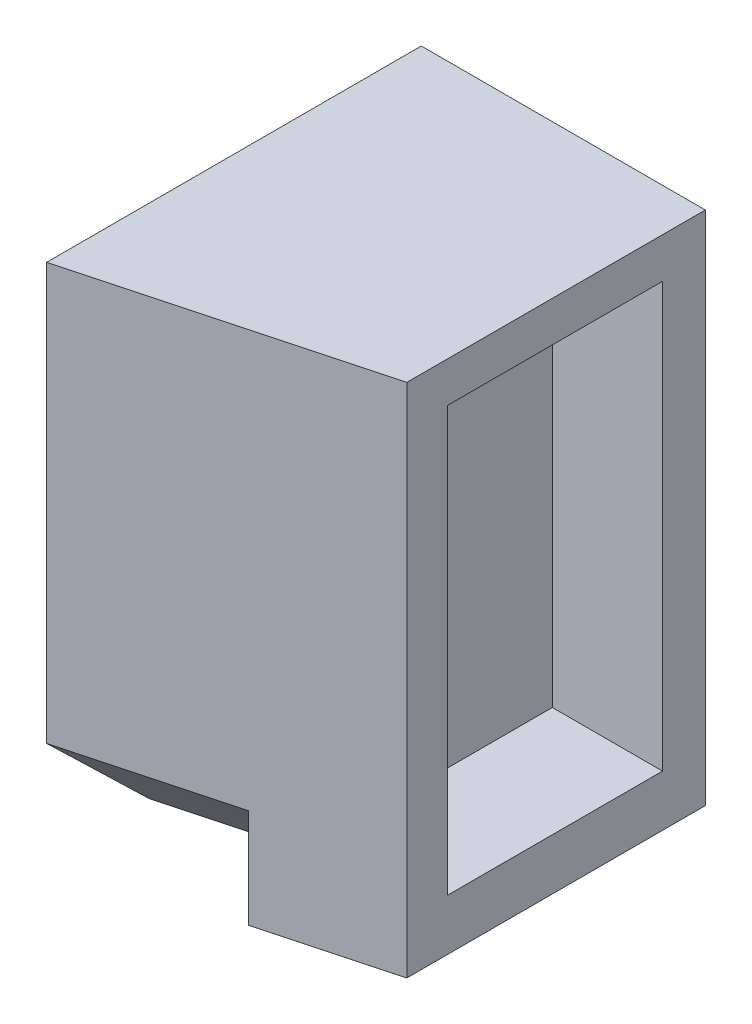
ISO-10303-21;
HEADER;
FILE_DESCRIPTION(('STEP AP214'),'2;1');
FILE_NAME('part.step','',(''),(''),'','','');
FILE_SCHEMA(('AUTOMOTIVE_DESIGN { 1 0 10303 214 1 1 1 1 }'));
ENDSEC;
DATA;
#1=APPLICATION_CONTEXT('core data for automotive mechanical design processes');
#2=APPLICATION_PROTOCOL_DEFINITION('international standard','automotive_design',2000,#1);
#3=PRODUCT_CONTEXT('',#1,'mechanical');
#4=PRODUCT('Part','Part','',(#3));
#5=PRODUCT_RELATED_PRODUCT_CATEGORY('part','',(#4));
#6=PRODUCT_DEFINITION_FORMATION('','',#4);
#7=PRODUCT_DEFINITION_CONTEXT('part definition',#1,'design');
#8=PRODUCT_DEFINITION('design','',#6,#7);
#9=PRODUCT_DEFINITION_SHAPE('','',#8);
#10=(LENGTH_UNIT() NAMED_UNIT(*) SI_UNIT(.MILLI.,.METRE.));
#11=(NAMED_UNIT(*) PLANE_ANGLE_UNIT() SI_UNIT($,.RADIAN.));
#12=(NAMED_UNIT(*) SI_UNIT($,.STERADIAN.) SOLID_ANGLE_UNIT());
#13=UNCERTAINTY_MEASURE_WITH_UNIT(LENGTH_MEASURE(1.E-05),#10,'distance_accuracy_value','');
#14=(GEOMETRIC_REPRESENTATION_CONTEXT(3) GLOBAL_UNCERTAINTY_ASSIGNED_CONTEXT((#13)) GLOBAL_UNIT_ASSIGNED_CONTEXT((#10,
#11,#12)) REPRESENTATION_CONTEXT('',''));
#15=CARTESIAN_POINT('',(0.,0.,0.));
#16=DIRECTION('',(0.,0.,1.));
#17=DIRECTION('',(1.,0.,0.));
#18=AXIS2_PLACEMENT_3D('',#15,#16,#17);
#19=CARTESIAN_POINT('',(0.,594.610277738046,0.));
#20=DIRECTION('',(1.,0.,0.));
#21=DIRECTION('',(0.,0.,-1.));
#22=AXIS2_PLACEMENT_3D('',#19,#20,#21);
#23=PLANE('',#22);
#24=DIRECTION('',(0.,0.,-1.));
#25=VECTOR('',#24,1.);
#26=CARTESIAN_POINT('',(0.,109.55,340.9));
#27=LINE('',#26,#25);
#28=CARTESIAN_POINT('',(0.,109.55,340.9));
#29=VERTEX_POINT('',#28);
#30=CARTESIAN_POINT('',(0.,109.55,90.9000000000001));
#31=VERTEX_POINT('',#30);
#32=EDGE_CURVE('E234',#29,#31,#27,.T.);
#33=ORIENTED_EDGE('',*,*,#32,.T.);
#34=DIRECTION('',(0.,1.,0.));
#35=VECTOR('',#34,1.);
#36=CARTESIAN_POINT('',(0.,309.55,90.9000000000001));
#37=LINE('',#36,#35);
#38=CARTESIAN_POINT('',(0.,309.55,90.9000000000001));
#39=VERTEX_POINT('',#38);
#40=EDGE_CURVE('E254',#31,#39,#37,.T.);
#41=ORIENTED_EDGE('',*,*,#40,.T.);
#42=DIRECTION('',(0.,0.,1.));
#43=VECTOR('',#42,1.);
#44=CARTESIAN_POINT('',(0.,309.55,340.9));
#45=LINE('',#44,#43);
#46=CARTESIAN_POINT('',(0.,309.55,340.9));
#47=VERTEX_POINT('',#46);
#48=EDGE_CURVE('E257',#39,#47,#45,.T.);
#49=ORIENTED_EDGE('',*,*,#48,.T.);
#50=DIRECTION('',(0.,-1.,0.));
#51=VECTOR('',#50,1.);
#52=CARTESIAN_POINT('',(0.,309.55,340.9));
#53=LINE('',#52,#51);
#54=EDGE_CURVE('E245',#47,#29,#53,.T.);
#55=ORIENTED_EDGE('',*,*,#54,.T.);
#56=EDGE_LOOP('',(#33,#41,#49,#55));
#57=FACE_BOUND('',#56,.T.);
#58=DIRECTION('',(0.,0.,1.));
#59=VECTOR('',#58,1.);
#60=CARTESIAN_POINT('',(0.,438.315,265.9));
#61=LINE('',#60,#59);
#62=CARTESIAN_POINT('',(0.,438.315,165.9));
#63=VERTEX_POINT('',#62);
#64=CARTESIAN_POINT('',(0.,438.315,265.9));
#65=VERTEX_POINT('',#64);
#66=EDGE_CURVE('E224',#63,#65,#61,.T.);
#67=ORIENTED_EDGE('',*,*,#66,.F.);
#68=DIRECTION('',(0.,-1.,0.));
#69=VECTOR('',#68,1.);
#70=CARTESIAN_POINT('',(0.,438.315,165.9));
#71=LINE('',#70,#69);
#72=CARTESIAN_POINT('',(0.,538.315,165.9));
#73=VERTEX_POINT('',#72);
#74=EDGE_CURVE('E207',#73,#63,#71,.T.);
#75=ORIENTED_EDGE('',*,*,#74,.F.);
#76=DIRECTION('',(0.,0.,-1.));
#77=VECTOR('',#76,1.);
#78=CARTESIAN_POINT('',(0.,538.315,265.9));
#79=LINE('',#78,#77);
#80=CARTESIAN_POINT('',(0.,538.315,265.9));
#81=VERTEX_POINT('',#80);
#82=EDGE_CURVE('E213',#81,#73,#79,.T.);
#83=ORIENTED_EDGE('',*,*,#82,.F.);
#84=DIRECTION('',(0.,1.,0.));
#85=VECTOR('',#84,1.);
#86=CARTESIAN_POINT('',(0.,438.315,265.9));
#87=LINE('',#86,#85);
#88=EDGE_CURVE('E227',#65,#81,#87,.T.);
#89=ORIENTED_EDGE('',*,*,#88,.F.);
#90=EDGE_LOOP('',(#67,#75,#83,#89));
#91=FACE_BOUND('',#90,.T.);
#92=DIRECTION('',(0.,-0.694746590606866,-0.719254596676403));
#93=VECTOR('',#92,1.);
#94=CARTESIAN_POINT('',(0.,130.362397394991,448.429017423315));
#95=LINE('',#94,#93);
#96=CARTESIAN_POINT('',(0.,114.3,431.8));
#97=VERTEX_POINT('',#96);
#98=CARTESIAN_POINT('',(0.,0.,313.467932579128));
#99=VERTEX_POINT('',#98);
#100=EDGE_CURVE('E192',#97,#99,#95,.T.);
#101=ORIENTED_EDGE('',*,*,#100,.F.);
#102=DIRECTION('',(0.,-1.,0.));
#103=VECTOR('',#102,1.);
#104=CARTESIAN_POINT('',(0.,594.610277738046,431.8));
#105=LINE('',#104,#103);
#106=CARTESIAN_POINT('',(0.,594.610277738046,431.8));
#107=VERTEX_POINT('',#106);
#108=EDGE_CURVE('E11',#107,#97,#105,.T.);
#109=ORIENTED_EDGE('',*,*,#108,.F.);
#110=DIRECTION('',(0.,0.,1.));
#111=VECTOR('',#110,1.);
#112=CARTESIAN_POINT('',(0.,594.610277738046,0.));
#113=LINE('',#112,#111);
#114=CARTESIAN_POINT('',(0.,594.610277738046,0.));
#115=VERTEX_POINT('',#114);
#116=EDGE_CURVE('E304',#115,#107,#113,.T.);
#117=ORIENTED_EDGE('',*,*,#116,.F.);
#118=DIRECTION('',(0.,-1.,0.));
#119=VECTOR('',#118,1.);
#120=CARTESIAN_POINT('',(0.,594.610277738046,0.));
#121=LINE('',#120,#119);
#122=CARTESIAN_POINT('',(0.,114.3,0.));
#123=VERTEX_POINT('',#122);
#124=EDGE_CURVE('E314',#115,#123,#121,.T.);
#125=ORIENTED_EDGE('',*,*,#124,.T.);
#126=DIRECTION('',(0.,0.707106781186548,-0.707106781186548));
#127=VECTOR('',#126,1.);
#128=CARTESIAN_POINT('',(0.,114.3,0.));
#129=LINE('',#128,#127);
#130=CARTESIAN_POINT('',(0.,0.,114.3));
#131=VERTEX_POINT('',#130);
#132=EDGE_CURVE('E196',#131,#123,#129,.T.);
#133=ORIENTED_EDGE('',*,*,#132,.F.);
#134=DIRECTION('',(0.,0.,1.));
#135=VECTOR('',#134,1.);
#136=CARTESIAN_POINT('',(0.,0.,0.));
#137=LINE('',#136,#135);
#138=EDGE_CURVE('E297',#131,#99,#137,.T.);
#139=ORIENTED_EDGE('',*,*,#138,.T.);
#140=EDGE_LOOP('',(#101,#109,#117,#125,#133,#139));
#141=FACE_BOUND('',#140,.T.);
#142=ADVANCED_FACE('F39',(#57,#91,#141),#23,.F.);
#143=CARTESIAN_POINT('',(0.,594.610277738046,431.8));
#144=DIRECTION('',(-0.258819045102518,0.,-0.965925826289069));
#145=DIRECTION('',(-0.965925826289069,0.,0.258819045102518));
#146=AXIS2_PLACEMENT_3D('',#143,#144,#145);
#147=PLANE('',#146);
#148=DIRECTION('',(-0.965925826289069,0.,0.258819045102518));
#149=VECTOR('',#148,1.);
#150=CARTESIAN_POINT('',(183.525906994923,114.3,382.624381430522));
#151=LINE('',#150,#149);
#152=CARTESIAN_POINT('',(183.525906994923,114.3,382.624381430522));
#153=VERTEX_POINT('',#152);
#154=EDGE_CURVE('E177',#153,#97,#151,.T.);
#155=ORIENTED_EDGE('',*,*,#154,.F.);
#156=DIRECTION('',(0.,-1.,0.));
#157=VECTOR('',#156,1.);
#158=CARTESIAN_POINT('',(183.525906994923,0.,382.624381430522));
#159=LINE('',#158,#157);
#160=CARTESIAN_POINT('',(183.525906994923,0.,382.624381430522));
#161=VERTEX_POINT('',#160);
#162=EDGE_CURVE('E181',#153,#161,#159,.T.);
#163=ORIENTED_EDGE('',*,*,#162,.T.);
#164=DIRECTION('',(0.965925826289069,0.,-0.258819045102518));
#165=VECTOR('',#164,1.);
#166=CARTESIAN_POINT('',(0.,0.,431.8));
#167=LINE('',#166,#165);
#168=CARTESIAN_POINT('',(327.385580215571,0.,344.077298167644));
#169=VERTEX_POINT('',#168);
#170=EDGE_CURVE('E317',#161,#169,#167,.T.);
#171=ORIENTED_EDGE('',*,*,#170,.T.);
#172=DIRECTION('',(0.,-1.,0.));
#173=VECTOR('',#172,1.);
#174=CARTESIAN_POINT('',(327.385580215571,594.610277738046,344.077298167644));
#175=LINE('',#174,#173);
#176=CARTESIAN_POINT('',(327.385580215571,594.610277738046,344.077298167644));
#177=VERTEX_POINT('',#176);
#178=EDGE_CURVE('E46',#177,#169,#175,.T.);
#179=ORIENTED_EDGE('',*,*,#178,.F.);
#180=DIRECTION('',(0.965925826289069,0.,-0.258819045102518));
#181=VECTOR('',#180,1.);
#182=CARTESIAN_POINT('',(0.,594.610277738046,431.8));
#183=LINE('',#182,#181);
#184=EDGE_CURVE('E307',#107,#177,#183,.T.);
#185=ORIENTED_EDGE('',*,*,#184,.F.);
#186=ORIENTED_EDGE('',*,*,#108,.T.);
#187=EDGE_LOOP('',(#155,#163,#171,#179,#185,#186));
#188=FACE_BOUND('',#187,.T.);
#189=ADVANCED_FACE('F189',(#188),#147,.F.);
#190=CARTESIAN_POINT('',(0.,0.,0.));
#191=DIRECTION('',(0.,-1.,0.));
#192=DIRECTION('',(0.,0.,-1.));
#193=AXIS2_PLACEMENT_3D('',#190,#191,#192);
#194=PLANE('',#193);
#195=DIRECTION('',(-0.258819045102518,0.,-0.965925826289069));
#196=VECTOR('',#195,1.);
#197=CARTESIAN_POINT('',(153.942890139705,0.,272.219059485681));
#198=LINE('',#197,#196);
#199=CARTESIAN_POINT('',(153.942890139705,0.,272.219059485681));
#200=VERTEX_POINT('',#199);
#201=EDGE_CURVE('E182',#161,#200,#198,.T.);
#202=ORIENTED_EDGE('',*,*,#201,.T.);
#203=DIRECTION('',(-0.965925826289069,0.,0.258819045102518));
#204=VECTOR('',#203,1.);
#205=CARTESIAN_POINT('',(153.942890139705,0.,272.219059485681));
#206=LINE('',#205,#204);
#207=EDGE_CURVE('E53',#200,#99,#206,.T.);
#208=ORIENTED_EDGE('',*,*,#207,.T.);
#209=ORIENTED_EDGE('',*,*,#138,.F.);
#210=DIRECTION('',(-1.,0.,0.));
#211=VECTOR('',#210,1.);
#212=CARTESIAN_POINT('',(172.,0.,114.3));
#213=LINE('',#212,#211);
#214=CARTESIAN_POINT('',(172.,0.,114.3));
#215=VERTEX_POINT('',#214);
#216=EDGE_CURVE('E202',#215,#131,#213,.T.);
#217=ORIENTED_EDGE('',*,*,#216,.F.);
#218=DIRECTION('',(0.,0.,1.));
#219=VECTOR('',#218,1.);
#220=CARTESIAN_POINT('',(172.,0.,114.3));
#221=LINE('',#220,#219);
#222=CARTESIAN_POINT('',(172.,0.,0.));
#223=VERTEX_POINT('',#222);
#224=EDGE_CURVE('E198',#223,#215,#221,.T.);
#225=ORIENTED_EDGE('',*,*,#224,.F.);
#226=DIRECTION('',(-1.,0.,0.));
#227=VECTOR('',#226,1.);
#228=CARTESIAN_POINT('',(327.385580215571,0.,0.));
#229=LINE('',#228,#227);
#230=CARTESIAN_POINT('',(327.385580215571,0.,0.));
#231=VERTEX_POINT('',#230);
#232=EDGE_CURVE('E308',#231,#223,#229,.T.);
#233=ORIENTED_EDGE('',*,*,#232,.F.);
#234=DIRECTION('',(0.,0.,-1.));
#235=VECTOR('',#234,1.);
#236=CARTESIAN_POINT('',(327.385580215571,0.,344.077298167644));
#237=LINE('',#236,#235);
#238=EDGE_CURVE('E319',#169,#231,#237,.T.);
#239=ORIENTED_EDGE('',*,*,#238,.F.);
#240=ORIENTED_EDGE('',*,*,#170,.F.);
#241=EDGE_LOOP('',(#202,#208,#209,#217,#225,#233,#239,#240));
#242=FACE_BOUND('',#241,.T.);
#243=ADVANCED_FACE('F336',(#242),#194,.T.);
#244=CARTESIAN_POINT('',(327.385580215571,594.610277738046,344.077298167644));
#245=DIRECTION('',(-1.,0.,0.));
#246=DIRECTION('',(0.,0.,1.));
#247=AXIS2_PLACEMENT_3D('',#244,#245,#246);
#248=PLANE('',#247);
#249=DIRECTION('',(0.,0.,-1.));
#250=VECTOR('',#249,1.);
#251=CARTESIAN_POINT('',(327.385580215571,59.1544754094797,49.3464453220122));
#252=LINE('',#251,#250);
#253=CARTESIAN_POINT('',(327.385580215571,59.1544754094797,296.996445322012));
#254=VERTEX_POINT('',#253);
#255=CARTESIAN_POINT('',(327.385580215571,59.1544754094797,49.3464453220122));
#256=VERTEX_POINT('',#255);
#257=EDGE_CURVE('E287',#254,#256,#252,.T.);
#258=ORIENTED_EDGE('',*,*,#257,.F.);
#259=DIRECTION('',(0.,-1.,0.));
#260=VECTOR('',#259,1.);
#261=CARTESIAN_POINT('',(327.385580215571,59.1544754094797,296.996445322012));
#262=LINE('',#261,#260);
#263=CARTESIAN_POINT('',(327.385580215571,548.10447540948,296.996445322012));
#264=VERTEX_POINT('',#263);
#265=EDGE_CURVE('E271',#264,#254,#262,.T.);
#266=ORIENTED_EDGE('',*,*,#265,.F.);
#267=DIRECTION('',(0.,0.,1.));
#268=VECTOR('',#267,1.);
#269=CARTESIAN_POINT('',(327.385580215571,548.10447540948,49.3464453220122));
#270=LINE('',#269,#268);
#271=CARTESIAN_POINT('',(327.385580215571,548.10447540948,49.3464453220122));
#272=VERTEX_POINT('',#271);
#273=EDGE_CURVE('E276',#272,#264,#270,.T.);
#274=ORIENTED_EDGE('',*,*,#273,.F.);
#275=DIRECTION('',(0.,1.,0.));
#276=VECTOR('',#275,1.);
#277=CARTESIAN_POINT('',(327.385580215571,59.1544754094797,49.3464453220122));
#278=LINE('',#277,#276);
#279=EDGE_CURVE('E290',#256,#272,#278,.T.);
#280=ORIENTED_EDGE('',*,*,#279,.F.);
#281=EDGE_LOOP('',(#258,#266,#274,#280));
#282=FACE_BOUND('',#281,.T.);
#283=ORIENTED_EDGE('',*,*,#238,.T.);
#284=DIRECTION('',(0.,-1.,0.));
#285=VECTOR('',#284,1.);
#286=CARTESIAN_POINT('',(327.385580215571,594.610277738046,0.));
#287=LINE('',#286,#285);
#288=CARTESIAN_POINT('',(327.385580215571,594.610277738046,0.));
#289=VERTEX_POINT('',#288);
#290=EDGE_CURVE('E325',#289,#231,#287,.T.);
#291=ORIENTED_EDGE('',*,*,#290,.F.);
#292=DIRECTION('',(0.,0.,-1.));
#293=VECTOR('',#292,1.);
#294=CARTESIAN_POINT('',(327.385580215571,594.610277738046,344.077298167644));
#295=LINE('',#294,#293);
#296=EDGE_CURVE('E310',#177,#289,#295,.T.);
#297=ORIENTED_EDGE('',*,*,#296,.F.);
#298=ORIENTED_EDGE('',*,*,#178,.T.);
#299=EDGE_LOOP('',(#283,#291,#297,#298));
#300=FACE_BOUND('',#299,.T.);
#301=ADVANCED_FACE('F332',(#282,#300),#248,.F.);
#302=CARTESIAN_POINT('',(327.385580215571,594.610277738046,0.));
#303=DIRECTION('',(0.,0.,1.));
#304=DIRECTION('',(1.,0.,0.));
#305=AXIS2_PLACEMENT_3D('',#302,#303,#304);
#306=PLANE('',#305);
#307=DIRECTION('',(0.,-1.,0.));
#308=VECTOR('',#307,1.);
#309=CARTESIAN_POINT('',(172.,0.,0.));
#310=LINE('',#309,#308);
#311=CARTESIAN_POINT('',(172.,114.3,0.));
#312=VERTEX_POINT('',#311);
#313=EDGE_CURVE('E61',#312,#223,#310,.T.);
#314=ORIENTED_EDGE('',*,*,#313,.F.);
#315=DIRECTION('',(-1.,0.,0.));
#316=VECTOR('',#315,1.);
#317=CARTESIAN_POINT('',(172.,114.3,0.));
#318=LINE('',#317,#316);
#319=EDGE_CURVE('E204',#312,#123,#318,.T.);
#320=ORIENTED_EDGE('',*,*,#319,.T.);
#321=ORIENTED_EDGE('',*,*,#124,.F.);
#322=DIRECTION('',(-1.,0.,0.));
#323=VECTOR('',#322,1.);
#324=CARTESIAN_POINT('',(327.385580215571,594.610277738046,0.));
#325=LINE('',#324,#323);
#326=EDGE_CURVE('E312',#289,#115,#325,.T.);
#327=ORIENTED_EDGE('',*,*,#326,.F.);
#328=ORIENTED_EDGE('',*,*,#290,.T.);
#329=ORIENTED_EDGE('',*,*,#232,.T.);
#330=EDGE_LOOP('',(#314,#320,#321,#327,#328,#329));
#331=FACE_BOUND('',#330,.T.);
#332=ADVANCED_FACE('F339',(#331),#306,.F.);
#333=CARTESIAN_POINT('',(0.,594.610277738046,0.));
#334=DIRECTION('',(0.,-1.,0.));
#335=DIRECTION('',(0.,0.,-1.));
#336=AXIS2_PLACEMENT_3D('',#333,#334,#335);
#337=PLANE('',#336);
#338=ORIENTED_EDGE('',*,*,#116,.T.);
#339=ORIENTED_EDGE('',*,*,#184,.T.);
#340=ORIENTED_EDGE('',*,*,#296,.T.);
#341=ORIENTED_EDGE('',*,*,#326,.T.);
#342=EDGE_LOOP('',(#338,#339,#340,#341));
#343=FACE_BOUND('',#342,.T.);
#344=ADVANCED_FACE('F344',(#343),#337,.F.);
#345=CARTESIAN_POINT('',(200.385580215571,59.1544754094797,296.996445322012));
#346=DIRECTION('',(0.,0.,1.));
#347=DIRECTION('',(1.,0.,0.));
#348=AXIS2_PLACEMENT_3D('',#345,#346,#347);
#349=PLANE('',#348);
#350=ORIENTED_EDGE('',*,*,#265,.T.);
#351=DIRECTION('',(1.,0.,0.));
#352=VECTOR('',#351,1.);
#353=CARTESIAN_POINT('',(200.385580215571,59.1544754094797,296.996445322012));
#354=LINE('',#353,#352);
#355=CARTESIAN_POINT('',(200.385580215571,59.1544754094797,296.996445322012));
#356=VERTEX_POINT('',#355);
#357=EDGE_CURVE('E285',#356,#254,#354,.T.);
#358=ORIENTED_EDGE('',*,*,#357,.F.);
#359=DIRECTION('',(0.,-1.,0.));
#360=VECTOR('',#359,1.);
#361=CARTESIAN_POINT('',(200.385580215571,59.1544754094797,296.996445322012));
#362=LINE('',#361,#360);
#363=CARTESIAN_POINT('',(200.385580215571,548.10447540948,296.996445322012));
#364=VERTEX_POINT('',#363);
#365=EDGE_CURVE('E272',#364,#356,#362,.T.);
#366=ORIENTED_EDGE('',*,*,#365,.F.);
#367=DIRECTION('',(1.,0.,0.));
#368=VECTOR('',#367,1.);
#369=CARTESIAN_POINT('',(200.385580215571,548.10447540948,296.996445322012));
#370=LINE('',#369,#368);
#371=EDGE_CURVE('E295',#364,#264,#370,.T.);
#372=ORIENTED_EDGE('',*,*,#371,.T.);
#373=EDGE_LOOP('',(#350,#358,#366,#372));
#374=FACE_BOUND('',#373,.T.);
#375=ADVANCED_FACE('F427',(#374),#349,.F.);
#376=CARTESIAN_POINT('',(200.385580215571,548.10447540948,49.3464453220122));
#377=DIRECTION('',(0.,1.,0.));
#378=DIRECTION('',(0.,0.,1.));
#379=AXIS2_PLACEMENT_3D('',#376,#377,#378);
#380=PLANE('',#379);
#381=ORIENTED_EDGE('',*,*,#273,.T.);
#382=ORIENTED_EDGE('',*,*,#371,.F.);
#383=DIRECTION('',(0.,0.,1.));
#384=VECTOR('',#383,1.);
#385=CARTESIAN_POINT('',(200.385580215571,548.10447540948,49.3464453220122));
#386=LINE('',#385,#384);
#387=CARTESIAN_POINT('',(200.385580215571,548.10447540948,49.3464453220122));
#388=VERTEX_POINT('',#387);
#389=EDGE_CURVE('E282',#388,#364,#386,.T.);
#390=ORIENTED_EDGE('',*,*,#389,.F.);
#391=DIRECTION('',(1.,0.,0.));
#392=VECTOR('',#391,1.);
#393=CARTESIAN_POINT('',(200.385580215571,548.10447540948,49.3464453220122));
#394=LINE('',#393,#392);
#395=EDGE_CURVE('E298',#388,#272,#394,.T.);
#396=ORIENTED_EDGE('',*,*,#395,.T.);
#397=EDGE_LOOP('',(#381,#382,#390,#396));
#398=FACE_BOUND('',#397,.T.);
#399=ADVANCED_FACE('F423',(#398),#380,.F.);
#400=CARTESIAN_POINT('',(200.385580215571,59.1544754094797,49.3464453220122));
#401=DIRECTION('',(0.,0.,-1.));
#402=DIRECTION('',(-1.,0.,0.));
#403=AXIS2_PLACEMENT_3D('',#400,#401,#402);
#404=PLANE('',#403);
#405=ORIENTED_EDGE('',*,*,#279,.T.);
#406=ORIENTED_EDGE('',*,*,#395,.F.);
#407=DIRECTION('',(0.,1.,0.));
#408=VECTOR('',#407,1.);
#409=CARTESIAN_POINT('',(200.385580215571,59.1544754094797,49.3464453220122));
#410=LINE('',#409,#408);
#411=CARTESIAN_POINT('',(200.385580215571,59.1544754094797,49.3464453220122));
#412=VERTEX_POINT('',#411);
#413=EDGE_CURVE('E279',#412,#388,#410,.T.);
#414=ORIENTED_EDGE('',*,*,#413,.F.);
#415=DIRECTION('',(1.,0.,0.));
#416=VECTOR('',#415,1.);
#417=CARTESIAN_POINT('',(200.385580215571,59.1544754094797,49.3464453220122));
#418=LINE('',#417,#416);
#419=EDGE_CURVE('E300',#412,#256,#418,.T.);
#420=ORIENTED_EDGE('',*,*,#419,.T.);
#421=EDGE_LOOP('',(#405,#406,#414,#420));
#422=FACE_BOUND('',#421,.T.);
#423=ADVANCED_FACE('F426',(#422),#404,.F.);
#424=CARTESIAN_POINT('',(200.385580215571,59.1544754094797,49.3464453220122));
#425=DIRECTION('',(0.,-1.,0.));
#426=DIRECTION('',(0.,0.,-1.));
#427=AXIS2_PLACEMENT_3D('',#424,#425,#426);
#428=PLANE('',#427);
#429=ORIENTED_EDGE('',*,*,#257,.T.);
#430=ORIENTED_EDGE('',*,*,#419,.F.);
#431=DIRECTION('',(0.,0.,-1.));
#432=VECTOR('',#431,1.);
#433=CARTESIAN_POINT('',(200.385580215571,59.1544754094797,49.3464453220122));
#434=LINE('',#433,#432);
#435=EDGE_CURVE('E275',#356,#412,#434,.T.);
#436=ORIENTED_EDGE('',*,*,#435,.F.);
#437=ORIENTED_EDGE('',*,*,#357,.T.);
#438=EDGE_LOOP('',(#429,#430,#436,#437));
#439=FACE_BOUND('',#438,.T.);
#440=ADVANCED_FACE('F421',(#439),#428,.F.);
#441=CARTESIAN_POINT('',(200.385580215571,0.,0.));
#442=DIRECTION('',(1.,0.,0.));
#443=DIRECTION('',(0.,0.,-1.));
#444=AXIS2_PLACEMENT_3D('',#441,#442,#443);
#445=PLANE('',#444);
#446=ORIENTED_EDGE('',*,*,#365,.T.);
#447=ORIENTED_EDGE('',*,*,#435,.T.);
#448=ORIENTED_EDGE('',*,*,#413,.T.);
#449=ORIENTED_EDGE('',*,*,#389,.T.);
#450=EDGE_LOOP('',(#446,#447,#448,#449));
#451=FACE_BOUND('',#450,.T.);
#452=ADVANCED_FACE('F417',(#451),#445,.T.);
#453=CARTESIAN_POINT('',(100.,109.55,340.9));
#454=DIRECTION('',(0.,1.,0.));
#455=DIRECTION('',(0.,0.,1.));
#456=AXIS2_PLACEMENT_3D('',#453,#454,#455);
#457=PLANE('',#456);
#458=ORIENTED_EDGE('',*,*,#32,.F.);
#459=DIRECTION('',(-1.,0.,0.));
#460=VECTOR('',#459,1.);
#461=CARTESIAN_POINT('',(100.,109.55,340.9));
#462=LINE('',#461,#460);
#463=CARTESIAN_POINT('',(100.,109.55,340.9));
#464=VERTEX_POINT('',#463);
#465=EDGE_CURVE('E251',#464,#29,#462,.T.);
#466=ORIENTED_EDGE('',*,*,#465,.F.);
#467=DIRECTION('',(0.,0.,-1.));
#468=VECTOR('',#467,1.);
#469=CARTESIAN_POINT('',(100.,109.55,340.9));
#470=LINE('',#469,#468);
#471=CARTESIAN_POINT('',(100.,109.55,90.9000000000001));
#472=VERTEX_POINT('',#471);
#473=EDGE_CURVE('E241',#464,#472,#470,.T.);
#474=ORIENTED_EDGE('',*,*,#473,.T.);
#475=DIRECTION('',(-1.,0.,0.));
#476=VECTOR('',#475,1.);
#477=CARTESIAN_POINT('',(100.,109.55,90.9000000000001));
#478=LINE('',#477,#476);
#479=EDGE_CURVE('E268',#472,#31,#478,.T.);
#480=ORIENTED_EDGE('',*,*,#479,.T.);
#481=EDGE_LOOP('',(#458,#466,#474,#480));
#482=FACE_BOUND('',#481,.T.);
#483=ADVANCED_FACE('F413',(#482),#457,.T.);
#484=CARTESIAN_POINT('',(100.,309.55,90.9000000000001));
#485=DIRECTION('',(0.,0.,1.));
#486=DIRECTION('',(1.,0.,0.));
#487=AXIS2_PLACEMENT_3D('',#484,#485,#486);
#488=PLANE('',#487);
#489=ORIENTED_EDGE('',*,*,#40,.F.);
#490=ORIENTED_EDGE('',*,*,#479,.F.);
#491=DIRECTION('',(0.,1.,0.));
#492=VECTOR('',#491,1.);
#493=CARTESIAN_POINT('',(100.,309.55,90.9000000000001));
#494=LINE('',#493,#492);
#495=CARTESIAN_POINT('',(100.,309.55,90.9000000000001));
#496=VERTEX_POINT('',#495);
#497=EDGE_CURVE('E244',#472,#496,#494,.T.);
#498=ORIENTED_EDGE('',*,*,#497,.T.);
#499=DIRECTION('',(-1.,0.,0.));
#500=VECTOR('',#499,1.);
#501=CARTESIAN_POINT('',(100.,309.55,90.9000000000001));
#502=LINE('',#501,#500);
#503=EDGE_CURVE('E266',#496,#39,#502,.T.);
#504=ORIENTED_EDGE('',*,*,#503,.T.);
#505=EDGE_LOOP('',(#489,#490,#498,#504));
#506=FACE_BOUND('',#505,.T.);
#507=ADVANCED_FACE('F409',(#506),#488,.T.);
#508=CARTESIAN_POINT('',(100.,309.55,340.9));
#509=DIRECTION('',(0.,-1.,0.));
#510=DIRECTION('',(0.,0.,-1.));
#511=AXIS2_PLACEMENT_3D('',#508,#509,#510);
#512=PLANE('',#511);
#513=ORIENTED_EDGE('',*,*,#48,.F.);
#514=ORIENTED_EDGE('',*,*,#503,.F.);
#515=DIRECTION('',(0.,0.,1.));
#516=VECTOR('',#515,1.);
#517=CARTESIAN_POINT('',(100.,309.55,340.9));
#518=LINE('',#517,#516);
#519=CARTESIAN_POINT('',(100.,309.55,340.9));
#520=VERTEX_POINT('',#519);
#521=EDGE_CURVE('E247',#496,#520,#518,.T.);
#522=ORIENTED_EDGE('',*,*,#521,.T.);
#523=DIRECTION('',(-1.,0.,0.));
#524=VECTOR('',#523,1.);
#525=CARTESIAN_POINT('',(100.,309.55,340.9));
#526=LINE('',#525,#524);
#527=EDGE_CURVE('E264',#520,#47,#526,.T.);
#528=ORIENTED_EDGE('',*,*,#527,.T.);
#529=EDGE_LOOP('',(#513,#514,#522,#528));
#530=FACE_BOUND('',#529,.T.);
#531=ADVANCED_FACE('F405',(#530),#512,.T.);
#532=CARTESIAN_POINT('',(100.,309.55,340.9));
#533=DIRECTION('',(0.,0.,-1.));
#534=DIRECTION('',(-1.,0.,0.));
#535=AXIS2_PLACEMENT_3D('',#532,#533,#534);
#536=PLANE('',#535);
#537=ORIENTED_EDGE('',*,*,#54,.F.);
#538=ORIENTED_EDGE('',*,*,#527,.F.);
#539=DIRECTION('',(0.,-1.,0.));
#540=VECTOR('',#539,1.);
#541=CARTESIAN_POINT('',(100.,309.55,340.9));
#542=LINE('',#541,#540);
#543=EDGE_CURVE('E249',#520,#464,#542,.T.);
#544=ORIENTED_EDGE('',*,*,#543,.T.);
#545=ORIENTED_EDGE('',*,*,#465,.T.);
#546=EDGE_LOOP('',(#537,#538,#544,#545));
#547=FACE_BOUND('',#546,.T.);
#548=ADVANCED_FACE('F401',(#547),#536,.T.);
#549=CARTESIAN_POINT('',(100.,0.,0.));
#550=DIRECTION('',(-1.,0.,0.));
#551=DIRECTION('',(0.,0.,1.));
#552=AXIS2_PLACEMENT_3D('',#549,#550,#551);
#553=PLANE('',#552);
#554=ORIENTED_EDGE('',*,*,#473,.F.);
#555=ORIENTED_EDGE('',*,*,#543,.F.);
#556=ORIENTED_EDGE('',*,*,#521,.F.);
#557=ORIENTED_EDGE('',*,*,#497,.F.);
#558=EDGE_LOOP('',(#554,#555,#556,#557));
#559=FACE_BOUND('',#558,.T.);
#560=ADVANCED_FACE('F398',(#559),#553,.T.);
#561=CARTESIAN_POINT('',(100.,438.315,165.9));
#562=DIRECTION('',(0.,0.,-1.));
#563=DIRECTION('',(-1.,0.,0.));
#564=AXIS2_PLACEMENT_3D('',#561,#562,#563);
#565=PLANE('',#564);
#566=ORIENTED_EDGE('',*,*,#74,.T.);
#567=DIRECTION('',(-1.,0.,0.));
#568=VECTOR('',#567,1.);
#569=CARTESIAN_POINT('',(100.,438.315,165.9));
#570=LINE('',#569,#568);
#571=CARTESIAN_POINT('',(100.,438.315,165.9));
#572=VERTEX_POINT('',#571);
#573=EDGE_CURVE('E222',#572,#63,#570,.T.);
#574=ORIENTED_EDGE('',*,*,#573,.F.);
#575=DIRECTION('',(0.,-1.,0.));
#576=VECTOR('',#575,1.);
#577=CARTESIAN_POINT('',(100.,438.315,165.9));
#578=LINE('',#577,#576);
#579=CARTESIAN_POINT('',(100.,538.315,165.9));
#580=VERTEX_POINT('',#579);
#581=EDGE_CURVE('E209',#580,#572,#578,.T.);
#582=ORIENTED_EDGE('',*,*,#581,.F.);
#583=DIRECTION('',(-1.,0.,0.));
#584=VECTOR('',#583,1.);
#585=CARTESIAN_POINT('',(100.,538.315,165.9));
#586=LINE('',#585,#584);
#587=EDGE_CURVE('E232',#580,#73,#586,.T.);
#588=ORIENTED_EDGE('',*,*,#587,.T.);
#589=EDGE_LOOP('',(#566,#574,#582,#588));
#590=FACE_BOUND('',#589,.T.);
#591=ADVANCED_FACE('F378',(#590),#565,.F.);
#592=CARTESIAN_POINT('',(100.,538.315,265.9));
#593=DIRECTION('',(0.,1.,0.));
#594=DIRECTION('',(0.,0.,1.));
#595=AXIS2_PLACEMENT_3D('',#592,#593,#594);
#596=PLANE('',#595);
#597=ORIENTED_EDGE('',*,*,#82,.T.);
#598=ORIENTED_EDGE('',*,*,#587,.F.);
#599=DIRECTION('',(0.,0.,-1.));
#600=VECTOR('',#599,1.);
#601=CARTESIAN_POINT('',(100.,538.315,265.9));
#602=LINE('',#601,#600);
#603=CARTESIAN_POINT('',(100.,538.315,265.9));
#604=VERTEX_POINT('',#603);
#605=EDGE_CURVE('E219',#604,#580,#602,.T.);
#606=ORIENTED_EDGE('',*,*,#605,.F.);
#607=DIRECTION('',(-1.,0.,0.));
#608=VECTOR('',#607,1.);
#609=CARTESIAN_POINT('',(100.,538.315,265.9));
#610=LINE('',#609,#608);
#611=EDGE_CURVE('E235',#604,#81,#610,.T.);
#612=ORIENTED_EDGE('',*,*,#611,.T.);
#613=EDGE_LOOP('',(#597,#598,#606,#612));
#614=FACE_BOUND('',#613,.T.);
#615=ADVANCED_FACE('F381',(#614),#596,.F.);
#616=CARTESIAN_POINT('',(100.,438.315,265.9));
#617=DIRECTION('',(0.,0.,1.));
#618=DIRECTION('',(1.,0.,0.));
#619=AXIS2_PLACEMENT_3D('',#616,#617,#618);
#620=PLANE('',#619);
#621=ORIENTED_EDGE('',*,*,#88,.T.);
#622=ORIENTED_EDGE('',*,*,#611,.F.);
#623=DIRECTION('',(0.,1.,0.));
#624=VECTOR('',#623,1.);
#625=CARTESIAN_POINT('',(100.,438.315,265.9));
#626=LINE('',#625,#624);
#627=CARTESIAN_POINT('',(100.,438.315,265.9));
#628=VERTEX_POINT('',#627);
#629=EDGE_CURVE('E216',#628,#604,#626,.T.);
#630=ORIENTED_EDGE('',*,*,#629,.F.);
#631=DIRECTION('',(-1.,0.,0.));
#632=VECTOR('',#631,1.);
#633=CARTESIAN_POINT('',(100.,438.315,265.9));
#634=LINE('',#633,#632);
#635=EDGE_CURVE('E237',#628,#65,#634,.T.);
#636=ORIENTED_EDGE('',*,*,#635,.T.);
#637=EDGE_LOOP('',(#621,#622,#630,#636));
#638=FACE_BOUND('',#637,.T.);
#639=ADVANCED_FACE('F383',(#638),#620,.F.);
#640=CARTESIAN_POINT('',(100.,438.315,265.9));
#641=DIRECTION('',(0.,-1.,0.));
#642=DIRECTION('',(0.,0.,-1.));
#643=AXIS2_PLACEMENT_3D('',#640,#641,#642);
#644=PLANE('',#643);
#645=ORIENTED_EDGE('',*,*,#66,.T.);
#646=ORIENTED_EDGE('',*,*,#635,.F.);
#647=DIRECTION('',(0.,0.,1.));
#648=VECTOR('',#647,1.);
#649=CARTESIAN_POINT('',(100.,438.315,265.9));
#650=LINE('',#649,#648);
#651=EDGE_CURVE('E212',#572,#628,#650,.T.);
#652=ORIENTED_EDGE('',*,*,#651,.F.);
#653=ORIENTED_EDGE('',*,*,#573,.T.);
#654=EDGE_LOOP('',(#645,#646,#652,#653));
#655=FACE_BOUND('',#654,.T.);
#656=ADVANCED_FACE('F373',(#655),#644,.F.);
#657=CARTESIAN_POINT('',(100.,0.,0.));
#658=DIRECTION('',(-1.,0.,0.));
#659=DIRECTION('',(0.,0.,1.));
#660=AXIS2_PLACEMENT_3D('',#657,#658,#659);
#661=PLANE('',#660);
#662=ORIENTED_EDGE('',*,*,#581,.T.);
#663=ORIENTED_EDGE('',*,*,#651,.T.);
#664=ORIENTED_EDGE('',*,*,#629,.T.);
#665=ORIENTED_EDGE('',*,*,#605,.T.);
#666=EDGE_LOOP('',(#662,#663,#664,#665));
#667=FACE_BOUND('',#666,.T.);
#668=ADVANCED_FACE('F360',(#667),#661,.T.);
#669=CARTESIAN_POINT('',(172.,114.3,0.));
#670=DIRECTION('',(0.,0.707106781186548,0.707106781186548));
#671=DIRECTION('',(0.,-0.707106781186548,0.707106781186548));
#672=AXIS2_PLACEMENT_3D('',#669,#670,#671);
#673=PLANE('',#672);
#674=ORIENTED_EDGE('',*,*,#132,.T.);
#675=ORIENTED_EDGE('',*,*,#319,.F.);
#676=DIRECTION('',(0.,0.707106781186548,-0.707106781186548));
#677=VECTOR('',#676,1.);
#678=CARTESIAN_POINT('',(172.,114.3,0.));
#679=LINE('',#678,#677);
#680=EDGE_CURVE('E200',#215,#312,#679,.T.);
#681=ORIENTED_EDGE('',*,*,#680,.F.);
#682=ORIENTED_EDGE('',*,*,#216,.T.);
#683=EDGE_LOOP('',(#674,#675,#681,#682));
#684=FACE_BOUND('',#683,.T.);
#685=ADVANCED_FACE('F351',(#684),#673,.F.);
#686=CARTESIAN_POINT('',(172.,0.,0.));
#687=DIRECTION('',(-1.,0.,0.));
#688=DIRECTION('',(0.,0.,1.));
#689=AXIS2_PLACEMENT_3D('',#686,#687,#688);
#690=PLANE('',#689);
#691=ORIENTED_EDGE('',*,*,#313,.T.);
#692=ORIENTED_EDGE('',*,*,#224,.T.);
#693=ORIENTED_EDGE('',*,*,#680,.T.);
#694=EDGE_LOOP('',(#691,#692,#693));
#695=FACE_BOUND('',#694,.T.);
#696=ADVANCED_FACE('F352',(#695),#690,.T.);
#697=CARTESIAN_POINT('',(183.525906994923,114.3,382.624381430522));
#698=DIRECTION('',(0.183012701892217,-0.707106781186547,0.68301270189222));
#699=DIRECTION('',(0.,-0.694746590606866,-0.719254596676403));
#700=AXIS2_PLACEMENT_3D('',#697,#698,#699);
#701=PLANE('',#700);
#702=ORIENTED_EDGE('',*,*,#100,.T.);
#703=ORIENTED_EDGE('',*,*,#207,.F.);
#704=DIRECTION('',(0.183012701892217,0.707106781186548,0.68301270189222));
#705=VECTOR('',#704,1.);
#706=CARTESIAN_POINT('',(183.525906994923,114.3,382.624381430522));
#707=LINE('',#706,#705);
#708=EDGE_CURVE('E173',#200,#153,#707,.T.);
#709=ORIENTED_EDGE('',*,*,#708,.T.);
#710=ORIENTED_EDGE('',*,*,#154,.T.);
#711=EDGE_LOOP('',(#702,#703,#709,#710));
#712=FACE_BOUND('',#711,.T.);
#713=ADVANCED_FACE('F175',(#712),#701,.T.);
#714=CARTESIAN_POINT('',(75.5759069949242,0.,-20.2505032465394));
#715=DIRECTION('',(-0.965925826289069,0.,0.258819045102518));
#716=DIRECTION('',(0.258819045102518,0.,0.965925826289069));
#717=AXIS2_PLACEMENT_3D('',#714,#715,#716);
#718=PLANE('',#717);
#719=ORIENTED_EDGE('',*,*,#201,.F.);
#720=ORIENTED_EDGE('',*,*,#162,.F.);
#721=ORIENTED_EDGE('',*,*,#708,.F.);
#722=EDGE_LOOP('',(#719,#720,#721));
#723=FACE_BOUND('',#722,.T.);
#724=ADVANCED_FACE('F185',(#723),#718,.T.);
#725=CLOSED_SHELL('',(#142,#189,#243,#301,#332,#344,#375,#399,#423,#440,#452,#483,#507,#531,
#548,#560,#591,#615,#639,#656,#668,#685,#696,#713,#724));
#726=MANIFOLD_SOLID_BREP('B2',#725);
#727=ADVANCED_BREP_SHAPE_REPRESENTATION('',(#18,#726),#14);
#728=SHAPE_DEFINITION_REPRESENTATION(#9,#727);
ENDSEC;
END-ISO-10303-21;
